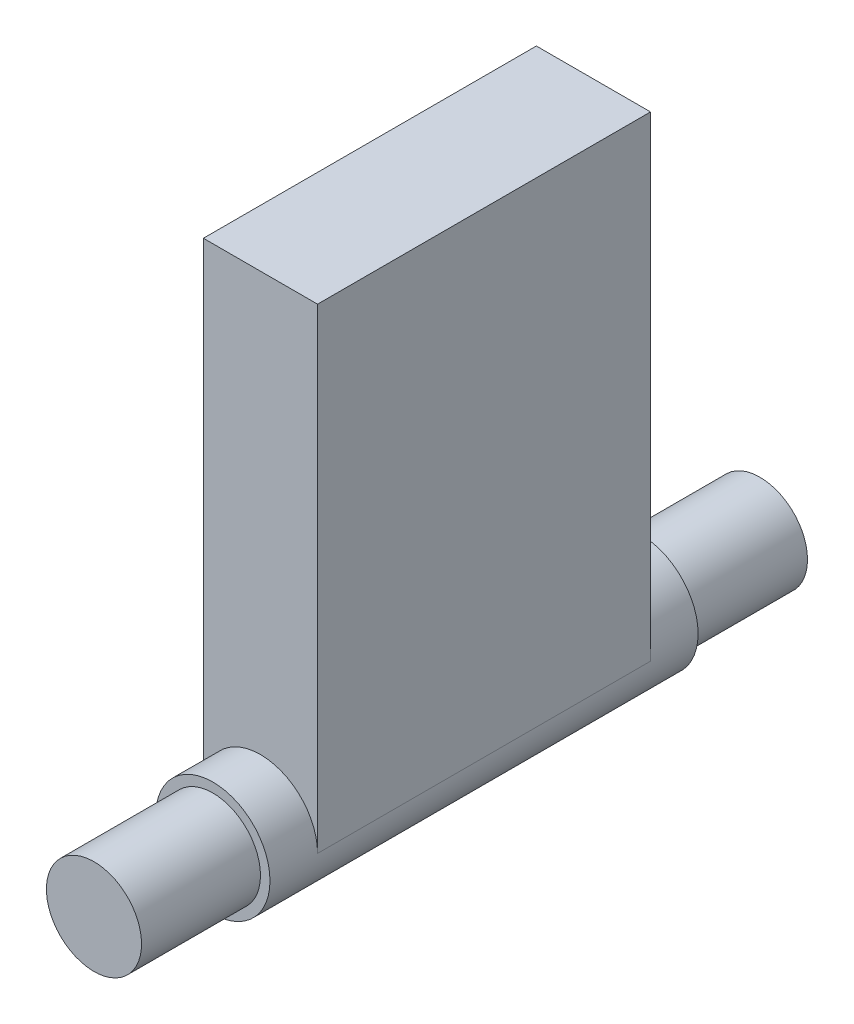
ISO-10303-21;
HEADER;
FILE_DESCRIPTION(('STEP AP214'),'2;1');
FILE_NAME('part.step','',(''),(''),'','','');
FILE_SCHEMA(('AUTOMOTIVE_DESIGN { 1 0 10303 214 1 1 1 1 }'));
ENDSEC;
DATA;
#1=APPLICATION_CONTEXT('core data for automotive mechanical design processes');
#2=APPLICATION_PROTOCOL_DEFINITION('international standard','automotive_design',2000,#1);
#3=PRODUCT_CONTEXT('',#1,'mechanical');
#4=PRODUCT('Part','Part','',(#3));
#5=PRODUCT_RELATED_PRODUCT_CATEGORY('part','',(#4));
#6=PRODUCT_DEFINITION_FORMATION('','',#4);
#7=PRODUCT_DEFINITION_CONTEXT('part definition',#1,'design');
#8=PRODUCT_DEFINITION('design','',#6,#7);
#9=PRODUCT_DEFINITION_SHAPE('','',#8);
#10=(LENGTH_UNIT() NAMED_UNIT(*) SI_UNIT(.MILLI.,.METRE.));
#11=(NAMED_UNIT(*) PLANE_ANGLE_UNIT() SI_UNIT($,.RADIAN.));
#12=(NAMED_UNIT(*) SI_UNIT($,.STERADIAN.) SOLID_ANGLE_UNIT());
#13=UNCERTAINTY_MEASURE_WITH_UNIT(LENGTH_MEASURE(1.E-05),#10,'distance_accuracy_value','');
#14=(GEOMETRIC_REPRESENTATION_CONTEXT(3) GLOBAL_UNCERTAINTY_ASSIGNED_CONTEXT((#13)) GLOBAL_UNIT_ASSIGNED_CONTEXT((#10,
#11,#12)) REPRESENTATION_CONTEXT('',''));
#15=CARTESIAN_POINT('',(0.,0.,0.));
#16=DIRECTION('',(0.,0.,1.));
#17=DIRECTION('',(1.,0.,0.));
#18=AXIS2_PLACEMENT_3D('',#15,#16,#17);
#19=CARTESIAN_POINT('',(0.,0.,35.));
#20=DIRECTION('',(0.,0.,-1.));
#21=DIRECTION('',(-1.,0.,0.));
#22=AXIS2_PLACEMENT_3D('',#19,#20,#21);
#23=CYLINDRICAL_SURFACE('',#22,6.);
#24=CARTESIAN_POINT('',(0.,0.,57.5));
#25=DIRECTION('',(0.,0.,1.));
#26=DIRECTION('',(1.,0.,0.));
#27=AXIS2_PLACEMENT_3D('',#24,#25,#26);
#28=CIRCLE('',#27,6.);
#29=CARTESIAN_POINT('',(6.,0.,57.5));
#30=VERTEX_POINT('',#29);
#31=EDGE_CURVE('E115',#30,#30,#28,.T.);
#32=ORIENTED_EDGE('',*,*,#31,.F.);
#33=EDGE_LOOP('',(#32));
#34=FACE_BOUND('',#33,.T.);
#35=CARTESIAN_POINT('',(0.,0.,12.5));
#36=DIRECTION('',(0.,0.,1.));
#37=DIRECTION('',(1.,0.,0.));
#38=AXIS2_PLACEMENT_3D('',#35,#36,#37);
#39=CIRCLE('',#38,6.);
#40=CARTESIAN_POINT('',(6.,0.,12.5));
#41=VERTEX_POINT('',#40);
#42=EDGE_CURVE('E129',#41,#41,#39,.T.);
#43=ORIENTED_EDGE('',*,*,#42,.T.);
#44=EDGE_LOOP('',(#43));
#45=FACE_BOUND('',#44,.T.);
#46=CARTESIAN_POINT('',(0.,0.,52.5));
#47=DIRECTION('',(0.,0.,-1.));
#48=DIRECTION('',(-1.,0.,0.));
#49=AXIS2_PLACEMENT_3D('',#46,#47,#48);
#50=CIRCLE('',#49,6.);
#51=CARTESIAN_POINT('',(-6.,0.,52.5));
#52=VERTEX_POINT('',#51);
#53=CARTESIAN_POINT('',(6.,0.,52.5));
#54=VERTEX_POINT('',#53);
#55=EDGE_CURVE('E11',#52,#54,#50,.T.);
#56=ORIENTED_EDGE('',*,*,#55,.F.);
#57=DIRECTION('',(0.,0.,1.));
#58=VECTOR('',#57,1.);
#59=CARTESIAN_POINT('',(-6.,0.,0.));
#60=LINE('',#59,#58);
#61=CARTESIAN_POINT('',(-6.,0.,17.5));
#62=VERTEX_POINT('',#61);
#63=EDGE_CURVE('E108',#62,#52,#60,.T.);
#64=ORIENTED_EDGE('',*,*,#63,.F.);
#65=CARTESIAN_POINT('',(0.,0.,17.5));
#66=DIRECTION('',(0.,0.,-1.));
#67=DIRECTION('',(-1.,0.,0.));
#68=AXIS2_PLACEMENT_3D('',#65,#66,#67);
#69=CIRCLE('',#68,6.);
#70=CARTESIAN_POINT('',(6.,0.,17.5));
#71=VERTEX_POINT('',#70);
#72=EDGE_CURVE('E54',#62,#71,#69,.T.);
#73=ORIENTED_EDGE('',*,*,#72,.T.);
#74=DIRECTION('',(0.,0.,-1.));
#75=VECTOR('',#74,1.);
#76=CARTESIAN_POINT('',(6.,0.,0.));
#77=LINE('',#76,#75);
#78=EDGE_CURVE('E61',#54,#71,#77,.T.);
#79=ORIENTED_EDGE('',*,*,#78,.F.);
#80=EDGE_LOOP('',(#56,#64,#73,#79));
#81=FACE_BOUND('',#80,.T.);
#82=ADVANCED_FACE('F45',(#34,#45,#81),#23,.T.);
#83=CARTESIAN_POINT('',(0.,0.,12.5));
#84=DIRECTION('',(0.,0.,-1.));
#85=DIRECTION('',(-1.,0.,0.));
#86=AXIS2_PLACEMENT_3D('',#83,#84,#85);
#87=CYLINDRICAL_SURFACE('',#86,5.);
#88=CARTESIAN_POINT('',(0.,0.,12.5));
#89=DIRECTION('',(0.,0.,1.));
#90=DIRECTION('',(1.,0.,0.));
#91=AXIS2_PLACEMENT_3D('',#88,#89,#90);
#92=CIRCLE('',#91,5.);
#93=CARTESIAN_POINT('',(5.,0.,12.5));
#94=VERTEX_POINT('',#93);
#95=EDGE_CURVE('E125',#94,#94,#92,.T.);
#96=ORIENTED_EDGE('',*,*,#95,.F.);
#97=EDGE_LOOP('',(#96));
#98=FACE_BOUND('',#97,.T.);
#99=CARTESIAN_POINT('',(0.,0.,0.));
#100=DIRECTION('',(0.,0.,1.));
#101=DIRECTION('',(1.,0.,0.));
#102=AXIS2_PLACEMENT_3D('',#99,#100,#101);
#103=CIRCLE('',#102,5.);
#104=CARTESIAN_POINT('',(5.,0.,0.));
#105=VERTEX_POINT('',#104);
#106=EDGE_CURVE('E133',#105,#105,#103,.T.);
#107=ORIENTED_EDGE('',*,*,#106,.T.);
#108=EDGE_LOOP('',(#107));
#109=FACE_BOUND('',#108,.T.);
#110=ADVANCED_FACE('F47',(#98,#109),#87,.T.);
#111=CARTESIAN_POINT('',(0.,0.,0.));
#112=DIRECTION('',(0.,0.,1.));
#113=DIRECTION('',(1.,0.,0.));
#114=AXIS2_PLACEMENT_3D('',#111,#112,#113);
#115=PLANE('',#114);
#116=ORIENTED_EDGE('',*,*,#106,.F.);
#117=EDGE_LOOP('',(#116));
#118=FACE_BOUND('',#117,.T.);
#119=ADVANCED_FACE('F143',(#118),#115,.F.);
#120=CARTESIAN_POINT('',(0.,0.,12.5));
#121=DIRECTION('',(0.,0.,1.));
#122=DIRECTION('',(1.,0.,0.));
#123=AXIS2_PLACEMENT_3D('',#120,#121,#122);
#124=PLANE('',#123);
#125=ORIENTED_EDGE('',*,*,#95,.T.);
#126=EDGE_LOOP('',(#125));
#127=FACE_BOUND('',#126,.T.);
#128=ORIENTED_EDGE('',*,*,#42,.F.);
#129=EDGE_LOOP('',(#128));
#130=FACE_BOUND('',#129,.T.);
#131=ADVANCED_FACE('F145',(#127,#130),#124,.F.);
#132=CARTESIAN_POINT('',(0.,0.,57.5));
#133=DIRECTION('',(0.,0.,-1.));
#134=DIRECTION('',(1.,0.,0.));
#135=AXIS2_PLACEMENT_3D('',#132,#133,#134);
#136=PLANE('',#135);
#137=CARTESIAN_POINT('',(0.,0.,57.5));
#138=DIRECTION('',(0.,0.,1.));
#139=DIRECTION('',(1.,0.,0.));
#140=AXIS2_PLACEMENT_3D('',#137,#138,#139);
#141=CIRCLE('',#140,5.);
#142=CARTESIAN_POINT('',(5.,0.,57.5));
#143=VERTEX_POINT('',#142);
#144=EDGE_CURVE('E121',#143,#143,#141,.T.);
#145=ORIENTED_EDGE('',*,*,#144,.F.);
#146=EDGE_LOOP('',(#145));
#147=FACE_BOUND('',#146,.T.);
#148=ORIENTED_EDGE('',*,*,#31,.T.);
#149=EDGE_LOOP('',(#148));
#150=FACE_BOUND('',#149,.T.);
#151=ADVANCED_FACE('F150',(#147,#150),#136,.F.);
#152=CARTESIAN_POINT('',(0.,0.,70.));
#153=DIRECTION('',(0.,0.,-1.));
#154=DIRECTION('',(-1.,0.,0.));
#155=AXIS2_PLACEMENT_3D('',#152,#153,#154);
#156=CYLINDRICAL_SURFACE('',#155,5.);
#157=CARTESIAN_POINT('',(0.,0.,70.));
#158=DIRECTION('',(0.,0.,1.));
#159=DIRECTION('',(1.,0.,0.));
#160=AXIS2_PLACEMENT_3D('',#157,#158,#159);
#161=CIRCLE('',#160,5.);
#162=CARTESIAN_POINT('',(5.,0.,70.));
#163=VERTEX_POINT('',#162);
#164=EDGE_CURVE('E110',#163,#163,#161,.T.);
#165=ORIENTED_EDGE('',*,*,#164,.F.);
#166=EDGE_LOOP('',(#165));
#167=FACE_BOUND('',#166,.T.);
#168=ORIENTED_EDGE('',*,*,#144,.T.);
#169=EDGE_LOOP('',(#168));
#170=FACE_BOUND('',#169,.T.);
#171=ADVANCED_FACE('F164',(#167,#170),#156,.T.);
#172=CARTESIAN_POINT('',(0.,0.,70.));
#173=DIRECTION('',(0.,0.,1.));
#174=DIRECTION('',(1.,0.,0.));
#175=AXIS2_PLACEMENT_3D('',#172,#173,#174);
#176=PLANE('',#175);
#177=ORIENTED_EDGE('',*,*,#164,.T.);
#178=EDGE_LOOP('',(#177));
#179=FACE_BOUND('',#178,.T.);
#180=ADVANCED_FACE('F168',(#179),#176,.T.);
#181=CARTESIAN_POINT('',(-6.,50.,0.));
#182=DIRECTION('',(1.,0.,0.));
#183=DIRECTION('',(0.,0.,-1.));
#184=AXIS2_PLACEMENT_3D('',#181,#182,#183);
#185=PLANE('',#184);
#186=ORIENTED_EDGE('',*,*,#63,.T.);
#187=DIRECTION('',(0.,-1.,0.));
#188=VECTOR('',#187,1.);
#189=CARTESIAN_POINT('',(-6.,50.,52.5));
#190=LINE('',#189,#188);
#191=CARTESIAN_POINT('',(-6.,50.,52.5));
#192=VERTEX_POINT('',#191);
#193=EDGE_CURVE('E88',#192,#52,#190,.T.);
#194=ORIENTED_EDGE('',*,*,#193,.F.);
#195=DIRECTION('',(0.,0.,1.));
#196=VECTOR('',#195,1.);
#197=CARTESIAN_POINT('',(-6.,50.,0.));
#198=LINE('',#197,#196);
#199=CARTESIAN_POINT('',(-6.,50.,17.5));
#200=VERTEX_POINT('',#199);
#201=EDGE_CURVE('E96',#200,#192,#198,.T.);
#202=ORIENTED_EDGE('',*,*,#201,.F.);
#203=DIRECTION('',(0.,-1.,0.));
#204=VECTOR('',#203,1.);
#205=CARTESIAN_POINT('',(-6.,50.,17.5));
#206=LINE('',#205,#204);
#207=EDGE_CURVE('E281',#200,#62,#206,.T.);
#208=ORIENTED_EDGE('',*,*,#207,.T.);
#209=EDGE_LOOP('',(#186,#194,#202,#208));
#210=FACE_BOUND('',#209,.T.);
#211=ADVANCED_FACE('F107',(#210),#185,.F.);
#212=CARTESIAN_POINT('',(0.,50.,52.5));
#213=DIRECTION('',(0.,0.,-1.));
#214=DIRECTION('',(-1.,0.,0.));
#215=AXIS2_PLACEMENT_3D('',#212,#213,#214);
#216=PLANE('',#215);
#217=ORIENTED_EDGE('',*,*,#193,.T.);
#218=ORIENTED_EDGE('',*,*,#55,.T.);
#219=DIRECTION('',(0.,-1.,0.));
#220=VECTOR('',#219,1.);
#221=CARTESIAN_POINT('',(6.,50.,52.5));
#222=LINE('',#221,#220);
#223=CARTESIAN_POINT('',(6.,50.,52.5));
#224=VERTEX_POINT('',#223);
#225=EDGE_CURVE('E91',#224,#54,#222,.T.);
#226=ORIENTED_EDGE('',*,*,#225,.F.);
#227=DIRECTION('',(1.,0.,0.));
#228=VECTOR('',#227,1.);
#229=CARTESIAN_POINT('',(0.,50.,52.5));
#230=LINE('',#229,#228);
#231=EDGE_CURVE('E84',#192,#224,#230,.T.);
#232=ORIENTED_EDGE('',*,*,#231,.F.);
#233=EDGE_LOOP('',(#217,#218,#226,#232));
#234=FACE_BOUND('',#233,.T.);
#235=ADVANCED_FACE('F86',(#234),#216,.F.);
#236=CARTESIAN_POINT('',(6.,50.,0.));
#237=DIRECTION('',(-1.,0.,0.));
#238=DIRECTION('',(0.,0.,1.));
#239=AXIS2_PLACEMENT_3D('',#236,#237,#238);
#240=PLANE('',#239);
#241=ORIENTED_EDGE('',*,*,#78,.T.);
#242=DIRECTION('',(0.,-1.,0.));
#243=VECTOR('',#242,1.);
#244=CARTESIAN_POINT('',(6.,50.,17.5));
#245=LINE('',#244,#243);
#246=CARTESIAN_POINT('',(6.,50.,17.5));
#247=VERTEX_POINT('',#246);
#248=EDGE_CURVE('E117',#247,#71,#245,.T.);
#249=ORIENTED_EDGE('',*,*,#248,.F.);
#250=DIRECTION('',(0.,0.,-1.));
#251=VECTOR('',#250,1.);
#252=CARTESIAN_POINT('',(6.,50.,0.));
#253=LINE('',#252,#251);
#254=EDGE_CURVE('E95',#224,#247,#253,.T.);
#255=ORIENTED_EDGE('',*,*,#254,.F.);
#256=ORIENTED_EDGE('',*,*,#225,.T.);
#257=EDGE_LOOP('',(#241,#249,#255,#256));
#258=FACE_BOUND('',#257,.T.);
#259=ADVANCED_FACE('F177',(#258),#240,.F.);
#260=CARTESIAN_POINT('',(0.,50.,17.5));
#261=DIRECTION('',(0.,0.,-1.));
#262=DIRECTION('',(-1.,0.,0.));
#263=AXIS2_PLACEMENT_3D('',#260,#261,#262);
#264=PLANE('',#263);
#265=ORIENTED_EDGE('',*,*,#72,.F.);
#266=ORIENTED_EDGE('',*,*,#207,.F.);
#267=DIRECTION('',(1.,0.,0.));
#268=VECTOR('',#267,1.);
#269=CARTESIAN_POINT('',(0.,50.,17.5));
#270=LINE('',#269,#268);
#271=EDGE_CURVE('E102',#200,#247,#270,.T.);
#272=ORIENTED_EDGE('',*,*,#271,.T.);
#273=ORIENTED_EDGE('',*,*,#248,.T.);
#274=EDGE_LOOP('',(#265,#266,#272,#273));
#275=FACE_BOUND('',#274,.T.);
#276=ADVANCED_FACE('F180',(#275),#264,.T.);
#277=CARTESIAN_POINT('',(0.,50.,0.));
#278=DIRECTION('',(0.,1.,0.));
#279=DIRECTION('',(0.,0.,1.));
#280=AXIS2_PLACEMENT_3D('',#277,#278,#279);
#281=PLANE('',#280);
#282=ORIENTED_EDGE('',*,*,#201,.T.);
#283=ORIENTED_EDGE('',*,*,#231,.T.);
#284=ORIENTED_EDGE('',*,*,#254,.T.);
#285=ORIENTED_EDGE('',*,*,#271,.F.);
#286=EDGE_LOOP('',(#282,#283,#284,#285));
#287=FACE_BOUND('',#286,.T.);
#288=ADVANCED_FACE('F100',(#287),#281,.T.);
#289=CLOSED_SHELL('',(#82,#110,#119,#131,#151,#171,#180,#211,#235,#259,#276,#288));
#290=MANIFOLD_SOLID_BREP('B2',#289);
#291=ADVANCED_BREP_SHAPE_REPRESENTATION('',(#18,#290),#14);
#292=SHAPE_DEFINITION_REPRESENTATION(#9,#291);
ENDSEC;
END-ISO-10303-21;
